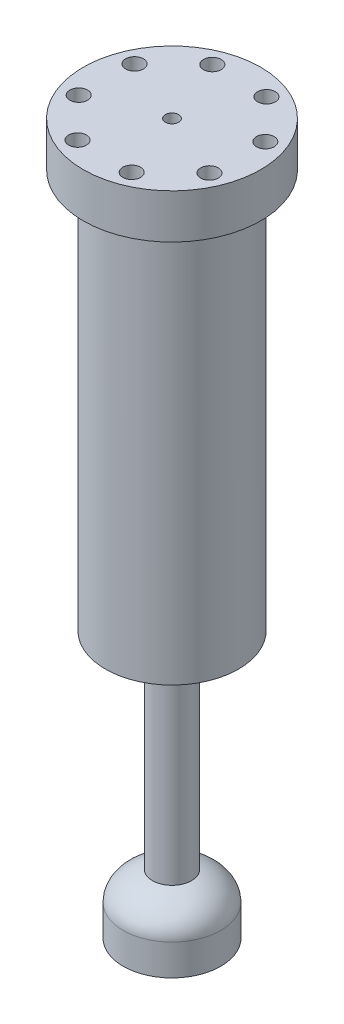
ISO-10303-21;
HEADER;
FILE_DESCRIPTION(('STEP AP214'),'2;1');
FILE_NAME('part.step','',(''),(''),'','','');
FILE_SCHEMA(('AUTOMOTIVE_DESIGN { 1 0 10303 214 1 1 1 1 }'));
ENDSEC;
DATA;
#1=APPLICATION_CONTEXT('core data for automotive mechanical design processes');
#2=APPLICATION_PROTOCOL_DEFINITION('international standard','automotive_design',2000,#1);
#3=PRODUCT_CONTEXT('',#1,'mechanical');
#4=PRODUCT('Part','Part','',(#3));
#5=PRODUCT_RELATED_PRODUCT_CATEGORY('part','',(#4));
#6=PRODUCT_DEFINITION_FORMATION('','',#4);
#7=PRODUCT_DEFINITION_CONTEXT('part definition',#1,'design');
#8=PRODUCT_DEFINITION('design','',#6,#7);
#9=PRODUCT_DEFINITION_SHAPE('','',#8);
#10=(LENGTH_UNIT() NAMED_UNIT(*) SI_UNIT(.MILLI.,.METRE.));
#11=(NAMED_UNIT(*) PLANE_ANGLE_UNIT() SI_UNIT($,.RADIAN.));
#12=(NAMED_UNIT(*) SI_UNIT($,.STERADIAN.) SOLID_ANGLE_UNIT());
#13=UNCERTAINTY_MEASURE_WITH_UNIT(LENGTH_MEASURE(1.E-05),#10,'distance_accuracy_value','');
#14=(GEOMETRIC_REPRESENTATION_CONTEXT(3) GLOBAL_UNCERTAINTY_ASSIGNED_CONTEXT((#13)) GLOBAL_UNIT_ASSIGNED_CONTEXT((#10,
#11,#12)) REPRESENTATION_CONTEXT('',''));
#15=CARTESIAN_POINT('',(0.,0.,0.));
#16=DIRECTION('',(0.,0.,1.));
#17=DIRECTION('',(1.,0.,0.));
#18=AXIS2_PLACEMENT_3D('',#15,#16,#17);
#19=CARTESIAN_POINT('',(0.,5.74427366838735,-1.93239721003523));
#20=DIRECTION('',(0.,-1.,0.));
#21=DIRECTION('',(0.,0.,-1.));
#22=AXIS2_PLACEMENT_3D('',#19,#20,#21);
#23=PLANE('',#22);
#24=CARTESIAN_POINT('',(0.,5.74427366838735,0.));
#25=DIRECTION('',(0.,-1.,0.));
#26=DIRECTION('',(0.,0.,-1.));
#27=AXIS2_PLACEMENT_3D('',#24,#25,#26);
#28=CIRCLE('',#27,0.75);
#29=CARTESIAN_POINT('',(0.,5.74427366838735,-0.75));
#30=VERTEX_POINT('',#29);
#31=EDGE_CURVE('E113',#30,#30,#28,.T.);
#32=ORIENTED_EDGE('',*,*,#31,.F.);
#33=EDGE_LOOP('',(#32));
#34=FACE_BOUND('',#33,.T.);
#35=CARTESIAN_POINT('',(0.,5.74427366838735,0.));
#36=DIRECTION('',(0.,-1.,0.));
#37=DIRECTION('',(0.,0.,-1.));
#38=AXIS2_PLACEMENT_3D('',#35,#36,#37);
#39=CIRCLE('',#38,1.93239721003523);
#40=CARTESIAN_POINT('',(0.,5.74427366838735,-1.93239721003523));
#41=VERTEX_POINT('',#40);
#42=EDGE_CURVE('E11',#41,#41,#39,.T.);
#43=ORIENTED_EDGE('',*,*,#42,.T.);
#44=EDGE_LOOP('',(#43));
#45=FACE_BOUND('',#44,.T.);
#46=ADVANCED_FACE('F37',(#34,#45),#23,.T.);
#47=CARTESIAN_POINT('',(0.,5.74427366838735,-1.93239721003523));
#48=CARTESIAN_POINT('',(0.,5.68742472138379,-2.13708725510991));
#49=CARTESIAN_POINT('',(0.,5.54936177273123,-2.55057603170065));
#50=CARTESIAN_POINT('',(0.,5.21595933519309,-3.2675620507788));
#51=CARTESIAN_POINT('',(0.,4.70592609161675,-3.97010856822877));
#52=CARTESIAN_POINT('',(0.,4.05818828111839,-4.42017896151395));
#53=CARTESIAN_POINT('',(0.,3.69715686582722,-4.5));
#54=CARTESIAN_POINT('',(0.,3.5,-4.5));
#55=B_SPLINE_CURVE_WITH_KNOTS('',3,(#47,#48,#49,#50,#51,#52,#53,#54),.UNSPECIFIED.,.F.,.F.,(4,1,
1,1,1,4),(3.14159265358979,3.28650258868072,3.43141252377164,3.7212323939535,4.01105226413535,
4.3008721343172),.UNSPECIFIED.);
#56=CARTESIAN_POINT('',(0.,5.74427366838735,0.));
#57=DIRECTION('',(0.,-1.,0.));
#58=AXIS1_PLACEMENT('',#56,#57);
#59=SURFACE_OF_REVOLUTION('',#55,#58);
#60=CARTESIAN_POINT('',(0.,3.5,0.));
#61=DIRECTION('',(0.,-1.,0.));
#62=DIRECTION('',(0.,0.,-1.));
#63=AXIS2_PLACEMENT_3D('',#60,#61,#62);
#64=CIRCLE('',#63,4.5);
#65=CARTESIAN_POINT('',(0.,3.5,-4.5));
#66=VERTEX_POINT('',#65);
#67=EDGE_CURVE('E45',#66,#66,#64,.T.);
#68=ORIENTED_EDGE('',*,*,#67,.T.);
#69=EDGE_LOOP('',(#68));
#70=FACE_BOUND('',#69,.T.);
#71=ORIENTED_EDGE('',*,*,#42,.F.);
#72=EDGE_LOOP('',(#71));
#73=FACE_BOUND('',#72,.T.);
#74=ADVANCED_FACE('F158',(#70,#73),#59,.F.);
#75=CARTESIAN_POINT('',(0.,5.74427366838735,0.));
#76=DIRECTION('',(0.,-1.,0.));
#77=DIRECTION('',(0.,0.,-1.));
#78=AXIS2_PLACEMENT_3D('',#75,#76,#77);
#79=CYLINDRICAL_SURFACE('',#78,4.5);
#80=CARTESIAN_POINT('',(0.,0.,0.));
#81=DIRECTION('',(0.,-1.,0.));
#82=DIRECTION('',(0.,0.,-1.));
#83=AXIS2_PLACEMENT_3D('',#80,#81,#82);
#84=CIRCLE('',#83,4.5);
#85=CARTESIAN_POINT('',(0.,0.,-4.5));
#86=VERTEX_POINT('',#85);
#87=EDGE_CURVE('E152',#86,#86,#84,.T.);
#88=ORIENTED_EDGE('',*,*,#87,.T.);
#89=EDGE_LOOP('',(#88));
#90=FACE_BOUND('',#89,.T.);
#91=ORIENTED_EDGE('',*,*,#67,.F.);
#92=EDGE_LOOP('',(#91));
#93=FACE_BOUND('',#92,.T.);
#94=ADVANCED_FACE('F161',(#90,#93),#79,.F.);
#95=CARTESIAN_POINT('',(0.,0.,-4.5));
#96=DIRECTION('',(0.,-1.,0.));
#97=DIRECTION('',(0.,0.,-1.));
#98=AXIS2_PLACEMENT_3D('',#95,#96,#97);
#99=PLANE('',#98);
#100=CARTESIAN_POINT('',(0.,0.,0.));
#101=DIRECTION('',(0.,-1.,0.));
#102=DIRECTION('',(0.,0.,-1.));
#103=AXIS2_PLACEMENT_3D('',#100,#101,#102);
#104=CIRCLE('',#103,5.5);
#105=CARTESIAN_POINT('',(0.,0.,-5.5));
#106=VERTEX_POINT('',#105);
#107=EDGE_CURVE('E149',#106,#106,#104,.T.);
#108=ORIENTED_EDGE('',*,*,#107,.T.);
#109=EDGE_LOOP('',(#108));
#110=FACE_BOUND('',#109,.T.);
#111=ORIENTED_EDGE('',*,*,#87,.F.);
#112=EDGE_LOOP('',(#111));
#113=FACE_BOUND('',#112,.T.);
#114=ADVANCED_FACE('F163',(#110,#113),#99,.T.);
#115=CARTESIAN_POINT('',(0.,5.74427366838735,0.));
#116=DIRECTION('',(0.,-1.,0.));
#117=DIRECTION('',(0.,0.,-1.));
#118=AXIS2_PLACEMENT_3D('',#115,#116,#117);
#119=CYLINDRICAL_SURFACE('',#118,5.5);
#120=CARTESIAN_POINT('',(0.,3.5,0.));
#121=DIRECTION('',(0.,-1.,0.));
#122=DIRECTION('',(0.,0.,-1.));
#123=AXIS2_PLACEMENT_3D('',#120,#121,#122);
#124=CIRCLE('',#123,5.5);
#125=CARTESIAN_POINT('',(0.,3.5,-5.5));
#126=VERTEX_POINT('',#125);
#127=EDGE_CURVE('E146',#126,#126,#124,.T.);
#128=ORIENTED_EDGE('',*,*,#127,.T.);
#129=EDGE_LOOP('',(#128));
#130=FACE_BOUND('',#129,.T.);
#131=ORIENTED_EDGE('',*,*,#107,.F.);
#132=EDGE_LOOP('',(#131));
#133=FACE_BOUND('',#132,.T.);
#134=ADVANCED_FACE('F170',(#130,#133),#119,.T.);
#135=CARTESIAN_POINT('',(0.,3.5,0.));
#136=DIRECTION('',(1.,0.,0.));
#137=DIRECTION('',(0.,0.,1.));
#138=AXIS2_PLACEMENT_3D('',#135,#136,#137);
#139=ELLIPSE('',#138,5.5,3.5);
#140=TRIMMED_CURVE('',#139,(PARAMETER_VALUE(1.5707963267949)),
(PARAMETER_VALUE(4.71238898038469)),.T.,.PARAMETER.);
#141=CARTESIAN_POINT('',(0.,5.74427366838735,0.));
#142=DIRECTION('',(0.,-1.,0.));
#143=AXIS1_PLACEMENT('',#141,#142);
#144=SURFACE_OF_REVOLUTION('',#140,#143);
#145=CARTESIAN_POINT('',(0.,6.70780298646909,0.));
#146=DIRECTION('',(0.,-1.,0.));
#147=DIRECTION('',(0.,0.,-1.));
#148=AXIS2_PLACEMENT_3D('',#145,#146,#147);
#149=CIRCLE('',#148,2.2);
#150=CARTESIAN_POINT('',(0.,6.70780298646909,-2.2));
#151=VERTEX_POINT('',#150);
#152=EDGE_CURVE('E143',#151,#151,#149,.T.);
#153=ORIENTED_EDGE('',*,*,#152,.T.);
#154=EDGE_LOOP('',(#153));
#155=FACE_BOUND('',#154,.T.);
#156=ORIENTED_EDGE('',*,*,#127,.F.);
#157=EDGE_LOOP('',(#156));
#158=FACE_BOUND('',#157,.T.);
#159=ADVANCED_FACE('F196',(#155,#158),#144,.F.);
#160=CARTESIAN_POINT('',(0.,5.74427366838735,0.));
#161=DIRECTION('',(0.,-1.,0.));
#162=DIRECTION('',(0.,0.,-1.));
#163=AXIS2_PLACEMENT_3D('',#160,#161,#162);
#164=CYLINDRICAL_SURFACE('',#163,2.2);
#165=CARTESIAN_POINT('',(0.,30.,0.));
#166=DIRECTION('',(0.,-1.,0.));
#167=DIRECTION('',(0.,0.,-1.));
#168=AXIS2_PLACEMENT_3D('',#165,#166,#167);
#169=CIRCLE('',#168,2.2);
#170=CARTESIAN_POINT('',(0.,30.,-2.2));
#171=VERTEX_POINT('',#170);
#172=EDGE_CURVE('E140',#171,#171,#169,.T.);
#173=ORIENTED_EDGE('',*,*,#172,.T.);
#174=EDGE_LOOP('',(#173));
#175=FACE_BOUND('',#174,.T.);
#176=ORIENTED_EDGE('',*,*,#152,.F.);
#177=EDGE_LOOP('',(#176));
#178=FACE_BOUND('',#177,.T.);
#179=ADVANCED_FACE('F200',(#175,#178),#164,.T.);
#180=CARTESIAN_POINT('',(0.,30.,-7.50000000000001));
#181=DIRECTION('',(0.,-1.,0.));
#182=DIRECTION('',(0.,0.,-1.));
#183=AXIS2_PLACEMENT_3D('',#180,#181,#182);
#184=PLANE('',#183);
#185=CARTESIAN_POINT('',(0.,30.,0.));
#186=DIRECTION('',(0.,-1.,0.));
#187=DIRECTION('',(0.,0.,-1.));
#188=AXIS2_PLACEMENT_3D('',#185,#186,#187);
#189=CIRCLE('',#188,7.50000000000001);
#190=CARTESIAN_POINT('',(0.,30.,-7.50000000000001));
#191=VERTEX_POINT('',#190);
#192=EDGE_CURVE('E135',#191,#191,#189,.T.);
#193=ORIENTED_EDGE('',*,*,#192,.T.);
#194=EDGE_LOOP('',(#193));
#195=FACE_BOUND('',#194,.T.);
#196=ORIENTED_EDGE('',*,*,#172,.F.);
#197=EDGE_LOOP('',(#196));
#198=FACE_BOUND('',#197,.T.);
#199=ADVANCED_FACE('F225',(#195,#198),#184,.T.);
#200=CARTESIAN_POINT('',(0.,5.74427366838735,0.));
#201=DIRECTION('',(0.,-1.,0.));
#202=DIRECTION('',(0.,0.,-1.));
#203=AXIS2_PLACEMENT_3D('',#200,#201,#202);
#204=CYLINDRICAL_SURFACE('',#203,7.5);
#205=CARTESIAN_POINT('',(0.,75.,0.));
#206=DIRECTION('',(0.,-1.,0.));
#207=DIRECTION('',(0.,0.,-1.));
#208=AXIS2_PLACEMENT_3D('',#205,#206,#207);
#209=CIRCLE('',#208,7.5);
#210=CARTESIAN_POINT('',(2.25233770760159,75.,-7.15380841586606));
#211=VERTEX_POINT('',#210);
#212=CARTESIAN_POINT('',(3.66564851081159,75.,-6.54316597643563));
#213=VERTEX_POINT('',#212);
#214=EDGE_CURVE('E127',#211,#213,#209,.T.);
#215=ORIENTED_EDGE('',*,*,#214,.T.);
#216=CARTESIAN_POINT('',(6.65114970873536,75.,-3.46586317560136));
#217=VERTEX_POINT('',#216);
#218=EDGE_CURVE('E136',#213,#217,#209,.T.);
#219=ORIENTED_EDGE('',*,*,#218,.T.);
#220=CARTESIAN_POINT('',(7.21872195180796,75.,-2.03471211292555));
#221=VERTEX_POINT('',#220);
#222=EDGE_CURVE('E493',#217,#221,#209,.T.);
#223=ORIENTED_EDGE('',*,*,#222,.T.);
#224=CARTESIAN_POINT('',(7.15380841586629,75.,2.25233770760085));
#225=VERTEX_POINT('',#224);
#226=EDGE_CURVE('E490',#221,#225,#209,.T.);
#227=ORIENTED_EDGE('',*,*,#226,.T.);
#228=CARTESIAN_POINT('',(6.54316597643561,75.,3.66564851081162));
#229=VERTEX_POINT('',#228);
#230=EDGE_CURVE('E487',#225,#229,#209,.T.);
#231=ORIENTED_EDGE('',*,*,#230,.T.);
#232=CARTESIAN_POINT('',(3.46586317560195,75.,6.65114970873505));
#233=VERTEX_POINT('',#232);
#234=EDGE_CURVE('E484',#229,#233,#209,.T.);
#235=ORIENTED_EDGE('',*,*,#234,.T.);
#236=CARTESIAN_POINT('',(2.03471211292531,75.,7.21872195180802));
#237=VERTEX_POINT('',#236);
#238=EDGE_CURVE('E481',#233,#237,#209,.T.);
#239=ORIENTED_EDGE('',*,*,#238,.T.);
#240=CARTESIAN_POINT('',(-2.25233770760061,75.,7.15380841586637));
#241=VERTEX_POINT('',#240);
#242=EDGE_CURVE('E478',#237,#241,#209,.T.);
#243=ORIENTED_EDGE('',*,*,#242,.T.);
#244=CARTESIAN_POINT('',(-3.66564851081184,75.,6.54316597643549));
#245=VERTEX_POINT('',#244);
#246=EDGE_CURVE('E475',#241,#245,#209,.T.);
#247=ORIENTED_EDGE('',*,*,#246,.T.);
#248=CARTESIAN_POINT('',(-6.65114970873518,75.,3.46586317560169));
#249=VERTEX_POINT('',#248);
#250=EDGE_CURVE('E472',#245,#249,#209,.T.);
#251=ORIENTED_EDGE('',*,*,#250,.T.);
#252=CARTESIAN_POINT('',(-7.21872195180805,75.,2.03471211292519));
#253=VERTEX_POINT('',#252);
#254=EDGE_CURVE('E471',#249,#253,#209,.T.);
#255=ORIENTED_EDGE('',*,*,#254,.T.);
#256=CARTESIAN_POINT('',(-7.15380841586617,75.,-2.25233770760123));
#257=VERTEX_POINT('',#256);
#258=EDGE_CURVE('E470',#253,#257,#209,.T.);
#259=ORIENTED_EDGE('',*,*,#258,.T.);
#260=CARTESIAN_POINT('',(-6.54316597643551,75.,-3.66564851081179));
#261=VERTEX_POINT('',#260);
#262=EDGE_CURVE('E132',#257,#261,#209,.T.);
#263=ORIENTED_EDGE('',*,*,#262,.T.);
#264=CARTESIAN_POINT('',(-3.46586317560104,75.,-6.65114970873553));
#265=VERTEX_POINT('',#264);
#266=EDGE_CURVE('E131',#261,#265,#209,.T.);
#267=ORIENTED_EDGE('',*,*,#266,.T.);
#268=CARTESIAN_POINT('',(-2.0347121129255,75.,-7.21872195180797));
#269=VERTEX_POINT('',#268);
#270=EDGE_CURVE('E102',#265,#269,#209,.T.);
#271=ORIENTED_EDGE('',*,*,#270,.T.);
#272=EDGE_CURVE('E116',#269,#211,#209,.T.);
#273=ORIENTED_EDGE('',*,*,#272,.T.);
#274=EDGE_LOOP('',(#215,#219,#223,#227,#231,#235,#239,#243,#247,#251,#255,#259,#263,#267,#271,#273));
#275=FACE_BOUND('',#274,.T.);
#276=ORIENTED_EDGE('',*,*,#192,.F.);
#277=EDGE_LOOP('',(#276));
#278=FACE_BOUND('',#277,.T.);
#279=ADVANCED_FACE('F128',(#275,#278),#204,.T.);
#280=CARTESIAN_POINT('',(0.,75.,-10.));
#281=DIRECTION('',(0.,-1.,0.));
#282=DIRECTION('',(0.,0.,-1.));
#283=AXIS2_PLACEMENT_3D('',#280,#281,#282);
#284=PLANE('',#283);
#285=CARTESIAN_POINT('',(-7.43442665904921,75.,-3.21215717062184));
#286=DIRECTION('',(0.,1.,0.));
#287=DIRECTION('',(0.,0.,1.));
#288=AXIS2_PLACEMENT_3D('',#285,#286,#287);
#289=CIRCLE('',#288,1.00000000000015);
#290=EDGE_CURVE('E465',#261,#257,#289,.T.);
#291=ORIENTED_EDGE('',*,*,#290,.T.);
#292=ORIENTED_EDGE('',*,*,#258,.F.);
#293=CARTESIAN_POINT('',(-7.52827162243132,75.,2.98559538726417));
#294=DIRECTION('',(0.,1.,0.));
#295=DIRECTION('',(0.,0.,1.));
#296=AXIS2_PLACEMENT_3D('',#293,#294,#295);
#297=CIRCLE('',#296,1.00000000000029);
#298=EDGE_CURVE('E536',#253,#249,#297,.T.);
#299=ORIENTED_EDGE('',*,*,#298,.T.);
#300=ORIENTED_EDGE('',*,*,#250,.F.);
#301=CARTESIAN_POINT('',(-3.21215717062155,75.,7.43442665904934));
#302=DIRECTION('',(0.,1.,0.));
#303=DIRECTION('',(0.,0.,1.));
#304=AXIS2_PLACEMENT_3D('',#301,#302,#303);
#305=CIRCLE('',#304,1.00000000000044);
#306=EDGE_CURVE('E529',#245,#241,#305,.T.);
#307=ORIENTED_EDGE('',*,*,#306,.T.);
#308=ORIENTED_EDGE('',*,*,#242,.F.);
#309=CARTESIAN_POINT('',(2.98559538726446,75.,7.52827162243145));
#310=DIRECTION('',(0.,1.,0.));
#311=DIRECTION('',(0.,0.,1.));
#312=AXIS2_PLACEMENT_3D('',#309,#310,#311);
#313=CIRCLE('',#312,1.00000000000051);
#314=EDGE_CURVE('E522',#237,#233,#313,.T.);
#315=ORIENTED_EDGE('',*,*,#314,.T.);
#316=ORIENTED_EDGE('',*,*,#234,.F.);
#317=CARTESIAN_POINT('',(7.43442665904963,75.,3.21215717062168));
#318=DIRECTION('',(0.,1.,0.));
#319=DIRECTION('',(0.,0.,1.));
#320=AXIS2_PLACEMENT_3D('',#317,#318,#319);
#321=CIRCLE('',#320,1.00000000000044);
#322=EDGE_CURVE('E515',#229,#225,#321,.T.);
#323=ORIENTED_EDGE('',*,*,#322,.T.);
#324=ORIENTED_EDGE('',*,*,#226,.F.);
#325=CARTESIAN_POINT('',(7.52827162243174,75.,-2.98559538726434));
#326=DIRECTION('',(0.,1.,0.));
#327=DIRECTION('',(0.,0.,1.));
#328=AXIS2_PLACEMENT_3D('',#325,#326,#327);
#329=CIRCLE('',#328,1.00000000000027);
#330=EDGE_CURVE('E500',#221,#217,#329,.T.);
#331=ORIENTED_EDGE('',*,*,#330,.T.);
#332=ORIENTED_EDGE('',*,*,#218,.F.);
#333=CARTESIAN_POINT('',(3.21215717062198,75.,-7.43442665904932));
#334=DIRECTION('',(0.,1.,0.));
#335=DIRECTION('',(0.,0.,1.));
#336=AXIS2_PLACEMENT_3D('',#333,#334,#335);
#337=CIRCLE('',#336,1.);
#338=EDGE_CURVE('E122',#213,#211,#337,.T.);
#339=ORIENTED_EDGE('',*,*,#338,.T.);
#340=ORIENTED_EDGE('',*,*,#272,.F.);
#341=CARTESIAN_POINT('',(-2.98559538726404,75.,-7.52827162243162));
#342=DIRECTION('',(0.,1.,0.));
#343=DIRECTION('',(0.,0.,1.));
#344=AXIS2_PLACEMENT_3D('',#341,#342,#343);
#345=CIRCLE('',#344,1.);
#346=EDGE_CURVE('E104',#269,#265,#345,.T.);
#347=ORIENTED_EDGE('',*,*,#346,.T.);
#348=ORIENTED_EDGE('',*,*,#266,.F.);
#349=EDGE_LOOP('',(#291,#292,#299,#300,#307,#308,#315,#316,#323,#324,#331,#332,#339,#340,#347,#348));
#350=FACE_BOUND('',#349,.T.);
#351=CARTESIAN_POINT('',(0.,75.,0.));
#352=DIRECTION('',(0.,-1.,0.));
#353=DIRECTION('',(0.,0.,-1.));
#354=AXIS2_PLACEMENT_3D('',#351,#352,#353);
#355=CIRCLE('',#354,10.);
#356=CARTESIAN_POINT('',(0.,75.,-10.));
#357=VERTEX_POINT('',#356);
#358=EDGE_CURVE('E125',#357,#357,#355,.T.);
#359=ORIENTED_EDGE('',*,*,#358,.T.);
#360=EDGE_LOOP('',(#359));
#361=FACE_BOUND('',#360,.T.);
#362=ADVANCED_FACE('F118',(#350,#361),#284,.T.);
#363=CARTESIAN_POINT('',(0.,5.74427366838735,0.));
#364=DIRECTION('',(0.,-1.,0.));
#365=DIRECTION('',(0.,0.,-1.));
#366=AXIS2_PLACEMENT_3D('',#363,#364,#365);
#367=CYLINDRICAL_SURFACE('',#366,10.);
#368=CARTESIAN_POINT('',(0.,80.,0.));
#369=DIRECTION('',(0.,-1.,0.));
#370=DIRECTION('',(0.,0.,-1.));
#371=AXIS2_PLACEMENT_3D('',#368,#369,#370);
#372=CIRCLE('',#371,10.);
#373=CARTESIAN_POINT('',(0.,80.,-10.));
#374=VERTEX_POINT('',#373);
#375=EDGE_CURVE('E184',#374,#374,#372,.T.);
#376=ORIENTED_EDGE('',*,*,#375,.T.);
#377=EDGE_LOOP('',(#376));
#378=FACE_BOUND('',#377,.T.);
#379=ORIENTED_EDGE('',*,*,#358,.F.);
#380=EDGE_LOOP('',(#379));
#381=FACE_BOUND('',#380,.T.);
#382=ADVANCED_FACE('F246',(#378,#381),#367,.T.);
#383=CARTESIAN_POINT('',(0.,80.,0.));
#384=DIRECTION('',(0.,1.,0.));
#385=DIRECTION('',(0.,0.,1.));
#386=AXIS2_PLACEMENT_3D('',#383,#384,#385);
#387=PLANE('',#386);
#388=CARTESIAN_POINT('',(-7.43442665904921,80.,-3.21215717062184));
#389=DIRECTION('',(0.,1.,0.));
#390=DIRECTION('',(0.,0.,1.));
#391=AXIS2_PLACEMENT_3D('',#388,#389,#390);
#392=CIRCLE('',#391,1.00000000000015);
#393=CARTESIAN_POINT('',(-7.43442665904921,80.,-2.21215717062169));
#394=VERTEX_POINT('',#393);
#395=EDGE_CURVE('E539',#394,#394,#392,.T.);
#396=ORIENTED_EDGE('',*,*,#395,.F.);
#397=EDGE_LOOP('',(#396));
#398=FACE_BOUND('',#397,.T.);
#399=CARTESIAN_POINT('',(-7.52827162243132,80.,2.98559538726417));
#400=DIRECTION('',(0.,1.,0.));
#401=DIRECTION('',(0.,0.,1.));
#402=AXIS2_PLACEMENT_3D('',#399,#400,#401);
#403=CIRCLE('',#402,1.00000000000029);
#404=CARTESIAN_POINT('',(-7.52827162243132,80.,3.98559538726446));
#405=VERTEX_POINT('',#404);
#406=EDGE_CURVE('E464',#405,#405,#403,.T.);
#407=ORIENTED_EDGE('',*,*,#406,.F.);
#408=EDGE_LOOP('',(#407));
#409=FACE_BOUND('',#408,.T.);
#410=CARTESIAN_POINT('',(-3.21215717062155,80.,7.43442665904934));
#411=DIRECTION('',(0.,1.,0.));
#412=DIRECTION('',(0.,0.,1.));
#413=AXIS2_PLACEMENT_3D('',#410,#411,#412);
#414=CIRCLE('',#413,1.00000000000044);
#415=CARTESIAN_POINT('',(-3.21215717062155,80.,8.43442665904978));
#416=VERTEX_POINT('',#415);
#417=EDGE_CURVE('E530',#416,#416,#414,.T.);
#418=ORIENTED_EDGE('',*,*,#417,.F.);
#419=EDGE_LOOP('',(#418));
#420=FACE_BOUND('',#419,.T.);
#421=CARTESIAN_POINT('',(2.98559538726446,80.,7.52827162243145));
#422=DIRECTION('',(0.,1.,0.));
#423=DIRECTION('',(0.,0.,1.));
#424=AXIS2_PLACEMENT_3D('',#421,#422,#423);
#425=CIRCLE('',#424,1.00000000000051);
#426=CARTESIAN_POINT('',(2.98559538726446,80.,8.52827162243196));
#427=VERTEX_POINT('',#426);
#428=EDGE_CURVE('E523',#427,#427,#425,.T.);
#429=ORIENTED_EDGE('',*,*,#428,.F.);
#430=EDGE_LOOP('',(#429));
#431=FACE_BOUND('',#430,.T.);
#432=CARTESIAN_POINT('',(7.43442665904963,80.,3.21215717062168));
#433=DIRECTION('',(0.,1.,0.));
#434=DIRECTION('',(0.,0.,1.));
#435=AXIS2_PLACEMENT_3D('',#432,#433,#434);
#436=CIRCLE('',#435,1.00000000000044);
#437=CARTESIAN_POINT('',(7.43442665904963,80.,4.21215717062212));
#438=VERTEX_POINT('',#437);
#439=EDGE_CURVE('E516',#438,#438,#436,.T.);
#440=ORIENTED_EDGE('',*,*,#439,.F.);
#441=EDGE_LOOP('',(#440));
#442=FACE_BOUND('',#441,.T.);
#443=CARTESIAN_POINT('',(7.52827162243174,80.,-2.98559538726434));
#444=DIRECTION('',(0.,1.,0.));
#445=DIRECTION('',(0.,0.,1.));
#446=AXIS2_PLACEMENT_3D('',#443,#444,#445);
#447=CIRCLE('',#446,1.00000000000027);
#448=CARTESIAN_POINT('',(7.52827162243174,80.,-1.98559538726406));
#449=VERTEX_POINT('',#448);
#450=EDGE_CURVE('E504',#449,#449,#447,.T.);
#451=ORIENTED_EDGE('',*,*,#450,.F.);
#452=EDGE_LOOP('',(#451));
#453=FACE_BOUND('',#452,.T.);
#454=CARTESIAN_POINT('',(3.21215717062198,80.,-7.43442665904932));
#455=DIRECTION('',(0.,1.,0.));
#456=DIRECTION('',(0.,0.,1.));
#457=AXIS2_PLACEMENT_3D('',#454,#455,#456);
#458=CIRCLE('',#457,1.);
#459=CARTESIAN_POINT('',(3.21215717062198,80.,-6.43442665904932));
#460=VERTEX_POINT('',#459);
#461=EDGE_CURVE('E506',#460,#460,#458,.T.);
#462=ORIENTED_EDGE('',*,*,#461,.F.);
#463=EDGE_LOOP('',(#462));
#464=FACE_BOUND('',#463,.T.);
#465=CARTESIAN_POINT('',(-2.98559538726404,80.,-7.52827162243162));
#466=DIRECTION('',(0.,1.,0.));
#467=DIRECTION('',(0.,0.,1.));
#468=AXIS2_PLACEMENT_3D('',#465,#466,#467);
#469=CIRCLE('',#468,1.);
#470=CARTESIAN_POINT('',(-2.98559538726404,80.,-6.52827162243162));
#471=VERTEX_POINT('',#470);
#472=EDGE_CURVE('E105',#471,#471,#469,.T.);
#473=ORIENTED_EDGE('',*,*,#472,.F.);
#474=EDGE_LOOP('',(#473));
#475=FACE_BOUND('',#474,.T.);
#476=CARTESIAN_POINT('',(0.,80.,0.));
#477=DIRECTION('',(0.,1.,0.));
#478=DIRECTION('',(0.,0.,1.));
#479=AXIS2_PLACEMENT_3D('',#476,#477,#478);
#480=CIRCLE('',#479,0.75);
#481=CARTESIAN_POINT('',(0.,80.,0.75));
#482=VERTEX_POINT('',#481);
#483=EDGE_CURVE('E40',#482,#482,#480,.T.);
#484=ORIENTED_EDGE('',*,*,#483,.F.);
#485=EDGE_LOOP('',(#484));
#486=FACE_BOUND('',#485,.T.);
#487=ORIENTED_EDGE('',*,*,#375,.F.);
#488=EDGE_LOOP('',(#487));
#489=FACE_BOUND('',#488,.T.);
#490=ADVANCED_FACE('F253',(#398,#409,#420,#431,#442,#453,#464,#475,#486,#489),#387,.T.);
#491=CARTESIAN_POINT('',(0.,80.7442736683874,0.));
#492=DIRECTION('',(0.,-1.,0.));
#493=DIRECTION('',(0.,0.,-1.));
#494=AXIS2_PLACEMENT_3D('',#491,#492,#493);
#495=CYLINDRICAL_SURFACE('',#494,0.75);
#496=ORIENTED_EDGE('',*,*,#483,.T.);
#497=EDGE_LOOP('',(#496));
#498=FACE_BOUND('',#497,.T.);
#499=ORIENTED_EDGE('',*,*,#31,.T.);
#500=EDGE_LOOP('',(#499));
#501=FACE_BOUND('',#500,.T.);
#502=ADVANCED_FACE('F260',(#498,#501),#495,.F.);
#503=CARTESIAN_POINT('',(-2.98559538726404,75.,-7.52827162243162));
#504=DIRECTION('',(0.,1.,0.));
#505=DIRECTION('',(0.,0.,1.));
#506=AXIS2_PLACEMENT_3D('',#503,#504,#505);
#507=CYLINDRICAL_SURFACE('',#506,1.);
#508=ORIENTED_EDGE('',*,*,#346,.F.);
#509=EDGE_CURVE('E51',#265,#269,#345,.T.);
#510=ORIENTED_EDGE('',*,*,#509,.F.);
#511=EDGE_LOOP('',(#508,#510));
#512=FACE_BOUND('',#511,.T.);
#513=ORIENTED_EDGE('',*,*,#472,.T.);
#514=EDGE_LOOP('',(#513));
#515=FACE_BOUND('',#514,.T.);
#516=ADVANCED_FACE('F108',(#512,#515),#507,.F.);
#517=CARTESIAN_POINT('',(-2.98559538726404,75.,-7.52827162243162));
#518=DIRECTION('',(0.,1.,0.));
#519=DIRECTION('',(0.,0.,1.));
#520=AXIS2_PLACEMENT_3D('',#517,#518,#519);
#521=PLANE('',#520);
#522=ORIENTED_EDGE('',*,*,#509,.T.);
#523=ORIENTED_EDGE('',*,*,#270,.F.);
#524=EDGE_LOOP('',(#522,#523));
#525=FACE_BOUND('',#524,.T.);
#526=ADVANCED_FACE('F100',(#525),#521,.T.);
#527=CARTESIAN_POINT('',(3.21215717062198,75.,-7.43442665904932));
#528=DIRECTION('',(0.,1.,0.));
#529=DIRECTION('',(0.,0.,1.));
#530=AXIS2_PLACEMENT_3D('',#527,#528,#529);
#531=CYLINDRICAL_SURFACE('',#530,1.);
#532=ORIENTED_EDGE('',*,*,#338,.F.);
#533=EDGE_CURVE('E567',#211,#213,#337,.T.);
#534=ORIENTED_EDGE('',*,*,#533,.F.);
#535=EDGE_LOOP('',(#532,#534));
#536=FACE_BOUND('',#535,.T.);
#537=ORIENTED_EDGE('',*,*,#461,.T.);
#538=EDGE_LOOP('',(#537));
#539=FACE_BOUND('',#538,.T.);
#540=ADVANCED_FACE('F280',(#536,#539),#531,.F.);
#541=CARTESIAN_POINT('',(3.21215717062198,75.,-7.43442665904932));
#542=DIRECTION('',(0.,1.,0.));
#543=DIRECTION('',(0.,0.,1.));
#544=AXIS2_PLACEMENT_3D('',#541,#542,#543);
#545=PLANE('',#544);
#546=ORIENTED_EDGE('',*,*,#533,.T.);
#547=ORIENTED_EDGE('',*,*,#214,.F.);
#548=EDGE_LOOP('',(#546,#547));
#549=FACE_BOUND('',#548,.T.);
#550=ADVANCED_FACE('F287',(#549),#545,.T.);
#551=CARTESIAN_POINT('',(7.52827162243174,75.,-2.98559538726434));
#552=DIRECTION('',(0.,1.,0.));
#553=DIRECTION('',(0.,0.,1.));
#554=AXIS2_PLACEMENT_3D('',#551,#552,#553);
#555=CYLINDRICAL_SURFACE('',#554,1.00000000000027);
#556=EDGE_CURVE('E503',#217,#221,#329,.T.);
#557=ORIENTED_EDGE('',*,*,#556,.F.);
#558=ORIENTED_EDGE('',*,*,#330,.F.);
#559=EDGE_LOOP('',(#557,#558));
#560=FACE_BOUND('',#559,.T.);
#561=ORIENTED_EDGE('',*,*,#450,.T.);
#562=EDGE_LOOP('',(#561));
#563=FACE_BOUND('',#562,.T.);
#564=ADVANCED_FACE('F295',(#560,#563),#555,.F.);
#565=CARTESIAN_POINT('',(7.52827162243174,75.,-2.98559538726434));
#566=DIRECTION('',(0.,1.,0.));
#567=DIRECTION('',(0.,0.,1.));
#568=AXIS2_PLACEMENT_3D('',#565,#566,#567);
#569=PLANE('',#568);
#570=ORIENTED_EDGE('',*,*,#556,.T.);
#571=ORIENTED_EDGE('',*,*,#222,.F.);
#572=EDGE_LOOP('',(#570,#571));
#573=FACE_BOUND('',#572,.T.);
#574=ADVANCED_FACE('F303',(#573),#569,.T.);
#575=CARTESIAN_POINT('',(7.43442665904963,75.,3.21215717062168));
#576=DIRECTION('',(0.,1.,0.));
#577=DIRECTION('',(0.,0.,1.));
#578=AXIS2_PLACEMENT_3D('',#575,#576,#577);
#579=CYLINDRICAL_SURFACE('',#578,1.00000000000044);
#580=EDGE_CURVE('E508',#225,#229,#321,.T.);
#581=ORIENTED_EDGE('',*,*,#580,.F.);
#582=ORIENTED_EDGE('',*,*,#322,.F.);
#583=EDGE_LOOP('',(#581,#582));
#584=FACE_BOUND('',#583,.T.);
#585=ORIENTED_EDGE('',*,*,#439,.T.);
#586=EDGE_LOOP('',(#585));
#587=FACE_BOUND('',#586,.T.);
#588=ADVANCED_FACE('F311',(#584,#587),#579,.F.);
#589=CARTESIAN_POINT('',(7.43442665904963,75.,3.21215717062168));
#590=DIRECTION('',(0.,1.,0.));
#591=DIRECTION('',(0.,0.,1.));
#592=AXIS2_PLACEMENT_3D('',#589,#590,#591);
#593=PLANE('',#592);
#594=ORIENTED_EDGE('',*,*,#580,.T.);
#595=ORIENTED_EDGE('',*,*,#230,.F.);
#596=EDGE_LOOP('',(#594,#595));
#597=FACE_BOUND('',#596,.T.);
#598=ADVANCED_FACE('F319',(#597),#593,.T.);
#599=CARTESIAN_POINT('',(2.98559538726446,75.,7.52827162243145));
#600=DIRECTION('',(0.,1.,0.));
#601=DIRECTION('',(0.,0.,1.));
#602=AXIS2_PLACEMENT_3D('',#599,#600,#601);
#603=CYLINDRICAL_SURFACE('',#602,1.00000000000051);
#604=EDGE_CURVE('E519',#233,#237,#313,.T.);
#605=ORIENTED_EDGE('',*,*,#604,.F.);
#606=ORIENTED_EDGE('',*,*,#314,.F.);
#607=EDGE_LOOP('',(#605,#606));
#608=FACE_BOUND('',#607,.T.);
#609=ORIENTED_EDGE('',*,*,#428,.T.);
#610=EDGE_LOOP('',(#609));
#611=FACE_BOUND('',#610,.T.);
#612=ADVANCED_FACE('F327',(#608,#611),#603,.F.);
#613=CARTESIAN_POINT('',(2.98559538726446,75.,7.52827162243145));
#614=DIRECTION('',(0.,1.,0.));
#615=DIRECTION('',(0.,0.,1.));
#616=AXIS2_PLACEMENT_3D('',#613,#614,#615);
#617=PLANE('',#616);
#618=ORIENTED_EDGE('',*,*,#604,.T.);
#619=ORIENTED_EDGE('',*,*,#238,.F.);
#620=EDGE_LOOP('',(#618,#619));
#621=FACE_BOUND('',#620,.T.);
#622=ADVANCED_FACE('F335',(#621),#617,.T.);
#623=CARTESIAN_POINT('',(-3.21215717062155,75.,7.43442665904934));
#624=DIRECTION('',(0.,1.,0.));
#625=DIRECTION('',(0.,0.,1.));
#626=AXIS2_PLACEMENT_3D('',#623,#624,#625);
#627=CYLINDRICAL_SURFACE('',#626,1.00000000000044);
#628=EDGE_CURVE('E526',#241,#245,#305,.T.);
#629=ORIENTED_EDGE('',*,*,#628,.F.);
#630=ORIENTED_EDGE('',*,*,#306,.F.);
#631=EDGE_LOOP('',(#629,#630));
#632=FACE_BOUND('',#631,.T.);
#633=ORIENTED_EDGE('',*,*,#417,.T.);
#634=EDGE_LOOP('',(#633));
#635=FACE_BOUND('',#634,.T.);
#636=ADVANCED_FACE('F343',(#632,#635),#627,.F.);
#637=CARTESIAN_POINT('',(-3.21215717062155,75.,7.43442665904934));
#638=DIRECTION('',(0.,1.,0.));
#639=DIRECTION('',(0.,0.,1.));
#640=AXIS2_PLACEMENT_3D('',#637,#638,#639);
#641=PLANE('',#640);
#642=ORIENTED_EDGE('',*,*,#628,.T.);
#643=ORIENTED_EDGE('',*,*,#246,.F.);
#644=EDGE_LOOP('',(#642,#643));
#645=FACE_BOUND('',#644,.T.);
#646=ADVANCED_FACE('F351',(#645),#641,.T.);
#647=CARTESIAN_POINT('',(-7.52827162243132,75.,2.98559538726417));
#648=DIRECTION('',(0.,1.,0.));
#649=DIRECTION('',(0.,0.,1.));
#650=AXIS2_PLACEMENT_3D('',#647,#648,#649);
#651=CYLINDRICAL_SURFACE('',#650,1.00000000000029);
#652=EDGE_CURVE('E533',#249,#253,#297,.T.);
#653=ORIENTED_EDGE('',*,*,#652,.F.);
#654=ORIENTED_EDGE('',*,*,#298,.F.);
#655=EDGE_LOOP('',(#653,#654));
#656=FACE_BOUND('',#655,.T.);
#657=ORIENTED_EDGE('',*,*,#406,.T.);
#658=EDGE_LOOP('',(#657));
#659=FACE_BOUND('',#658,.T.);
#660=ADVANCED_FACE('F359',(#656,#659),#651,.F.);
#661=CARTESIAN_POINT('',(-7.52827162243132,75.,2.98559538726417));
#662=DIRECTION('',(0.,1.,0.));
#663=DIRECTION('',(0.,0.,1.));
#664=AXIS2_PLACEMENT_3D('',#661,#662,#663);
#665=PLANE('',#664);
#666=ORIENTED_EDGE('',*,*,#652,.T.);
#667=ORIENTED_EDGE('',*,*,#254,.F.);
#668=EDGE_LOOP('',(#666,#667));
#669=FACE_BOUND('',#668,.T.);
#670=ADVANCED_FACE('F367',(#669),#665,.T.);
#671=CARTESIAN_POINT('',(-7.43442665904921,75.,-3.21215717062184));
#672=DIRECTION('',(0.,1.,0.));
#673=DIRECTION('',(0.,0.,1.));
#674=AXIS2_PLACEMENT_3D('',#671,#672,#673);
#675=CYLINDRICAL_SURFACE('',#674,1.00000000000015);
#676=EDGE_CURVE('E58',#257,#261,#289,.T.);
#677=ORIENTED_EDGE('',*,*,#676,.F.);
#678=ORIENTED_EDGE('',*,*,#290,.F.);
#679=EDGE_LOOP('',(#677,#678));
#680=FACE_BOUND('',#679,.T.);
#681=ORIENTED_EDGE('',*,*,#395,.T.);
#682=EDGE_LOOP('',(#681));
#683=FACE_BOUND('',#682,.T.);
#684=ADVANCED_FACE('F375',(#680,#683),#675,.F.);
#685=CARTESIAN_POINT('',(-7.43442665904921,75.,-3.21215717062184));
#686=DIRECTION('',(0.,1.,0.));
#687=DIRECTION('',(0.,0.,1.));
#688=AXIS2_PLACEMENT_3D('',#685,#686,#687);
#689=PLANE('',#688);
#690=ORIENTED_EDGE('',*,*,#676,.T.);
#691=ORIENTED_EDGE('',*,*,#262,.F.);
#692=EDGE_LOOP('',(#690,#691));
#693=FACE_BOUND('',#692,.T.);
#694=ADVANCED_FACE('F383',(#693),#689,.T.);
#695=CLOSED_SHELL('',(#46,#74,#94,#114,#134,#159,#179,#199,#279,#362,#382,#490,#502,#516,#526,
#540,#550,#564,#574,#588,#598,#612,#622,#636,#646,#660,#670,#684,#694));
#696=MANIFOLD_SOLID_BREP('B2',#695);
#697=ADVANCED_BREP_SHAPE_REPRESENTATION('',(#18,#696),#14);
#698=SHAPE_DEFINITION_REPRESENTATION(#9,#697);
ENDSEC;
END-ISO-10303-21;
